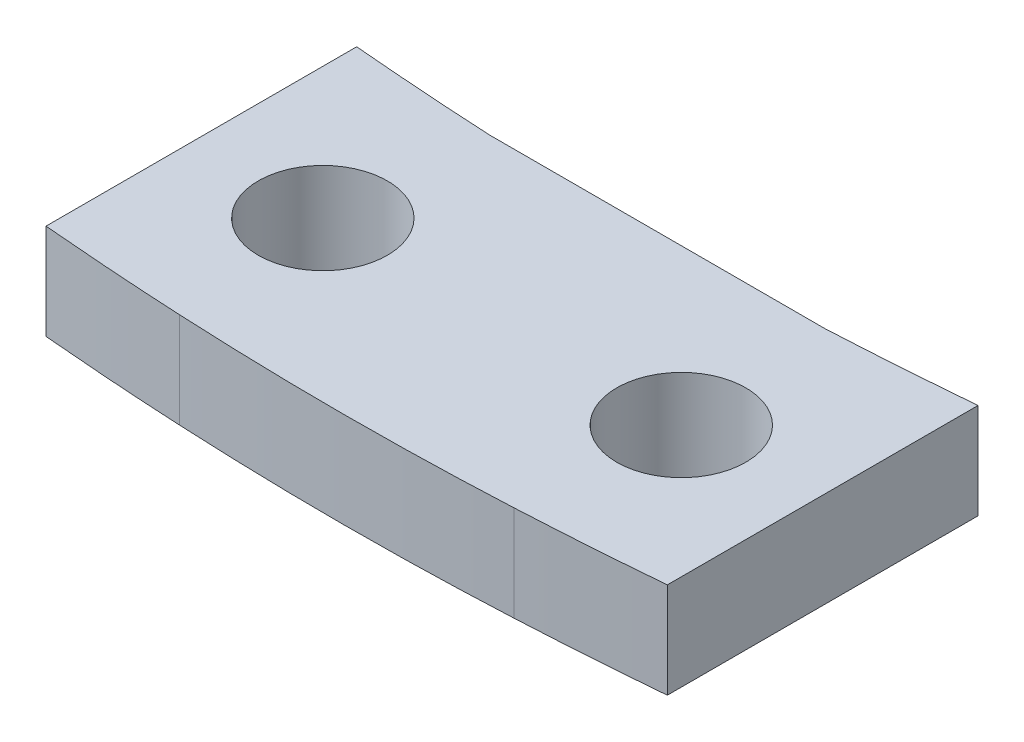
ISO-10303-21;
HEADER;
FILE_DESCRIPTION(('STEP AP214'),'2;1');
FILE_NAME('part.step','',(''),(''),'','','');
FILE_SCHEMA(('AUTOMOTIVE_DESIGN { 1 0 10303 214 1 1 1 1 }'));
ENDSEC;
DATA;
#1=APPLICATION_CONTEXT('core data for automotive mechanical design processes');
#2=APPLICATION_PROTOCOL_DEFINITION('international standard','automotive_design',2000,#1);
#3=PRODUCT_CONTEXT('',#1,'mechanical');
#4=PRODUCT('Part','Part','',(#3));
#5=PRODUCT_RELATED_PRODUCT_CATEGORY('part','',(#4));
#6=PRODUCT_DEFINITION_FORMATION('','',#4);
#7=PRODUCT_DEFINITION_CONTEXT('part definition',#1,'design');
#8=PRODUCT_DEFINITION('design','',#6,#7);
#9=PRODUCT_DEFINITION_SHAPE('','',#8);
#10=(LENGTH_UNIT() NAMED_UNIT(*) SI_UNIT(.MILLI.,.METRE.));
#11=(NAMED_UNIT(*) PLANE_ANGLE_UNIT() SI_UNIT($,.RADIAN.));
#12=(NAMED_UNIT(*) SI_UNIT($,.STERADIAN.) SOLID_ANGLE_UNIT());
#13=UNCERTAINTY_MEASURE_WITH_UNIT(LENGTH_MEASURE(1.E-05),#10,'distance_accuracy_value','');
#14=(GEOMETRIC_REPRESENTATION_CONTEXT(3) GLOBAL_UNCERTAINTY_ASSIGNED_CONTEXT((#13)) GLOBAL_UNIT_ASSIGNED_CONTEXT((#10,
#11,#12)) REPRESENTATION_CONTEXT('',''));
#15=CARTESIAN_POINT('',(0.,0.,0.));
#16=DIRECTION('',(0.,0.,1.));
#17=DIRECTION('',(1.,0.,0.));
#18=AXIS2_PLACEMENT_3D('',#15,#16,#17);
#19=CARTESIAN_POINT('',(10.0017972964312,4.,-6.68003144721764));
#20=DIRECTION('',(0.,-1.,0.));
#21=DIRECTION('',(0.,0.,-1.));
#22=AXIS2_PLACEMENT_3D('',#19,#20,#21);
#23=PLANE('',#22);
#24=CARTESIAN_POINT('',(-7.50000000000098,4.,0.));
#25=DIRECTION('',(0.,1.,0.));
#26=DIRECTION('',(0.,0.,1.));
#27=AXIS2_PLACEMENT_3D('',#24,#25,#26);
#28=CIRCLE('',#27,2.7);
#29=CARTESIAN_POINT('',(-7.50000000000098,4.,2.69999999999992));
#30=VERTEX_POINT('',#29);
#31=EDGE_CURVE('E213',#30,#30,#28,.T.);
#32=ORIENTED_EDGE('',*,*,#31,.F.);
#33=EDGE_LOOP('',(#32));
#34=FACE_BOUND('',#33,.T.);
#35=CARTESIAN_POINT('',(12.9999999999979,4.,-6.9165988328568));
#36=CARTESIAN_POINT('',(11.0025987207412,4.,-6.74133582895128));
#37=CARTESIAN_POINT('',(9.00219406974358,4.,-6.59988175267683));
#38=CARTESIAN_POINT('',(6.99999999999719,4.,-6.50000000000001));
#39=B_SPLINE_CURVE_WITH_KNOTS('',3,(#35,#36,#37,#38),.UNSPECIFIED.,.F.,.F.,(4,4),
(0.769001891352631,1.),.UNSPECIFIED.);
#40=CARTESIAN_POINT('',(12.9999999999985,4.,-6.9165988328568));
#41=VERTEX_POINT('',#40);
#42=CARTESIAN_POINT('',(6.9999999999981,4.,-6.50000000000009));
#43=VERTEX_POINT('',#42);
#44=EDGE_CURVE('E218',#41,#43,#39,.T.);
#45=ORIENTED_EDGE('',*,*,#44,.T.);
#46=DIRECTION('',(-1.,0.,0.));
#47=VECTOR('',#46,1.);
#48=CARTESIAN_POINT('',(6.9999999999981,4.,-6.50000000000009));
#49=LINE('',#48,#47);
#50=CARTESIAN_POINT('',(-6.99999999999916,4.,-6.50000000000001));
#51=VERTEX_POINT('',#50);
#52=EDGE_CURVE('E96',#43,#51,#49,.T.);
#53=ORIENTED_EDGE('',*,*,#52,.T.);
#54=CARTESIAN_POINT('',(-6.99999999999916,4.,-6.50000000000001));
#55=CARTESIAN_POINT('',(-9.00219406974555,4.,-6.59988175267683));
#56=CARTESIAN_POINT('',(-11.0025987207431,4.,-6.74133582895128));
#57=CARTESIAN_POINT('',(-12.9999999999998,4.,-6.9165988328568));
#58=B_SPLINE_CURVE_WITH_KNOTS('',3,(#54,#55,#56,#57),.UNSPECIFIED.,.F.,.F.,(4,4),
(1.4770263050022E-08,0.230998108647369),.UNSPECIFIED.);
#59=CARTESIAN_POINT('',(-12.9999996139176,4.,-6.91659883267921));
#60=VERTEX_POINT('',#59);
#61=EDGE_CURVE('E165',#51,#60,#58,.T.);
#62=ORIENTED_EDGE('',*,*,#61,.T.);
#63=DIRECTION('',(2.96987209127525E-08,0.,1.));
#64=VECTOR('',#63,1.);
#65=CARTESIAN_POINT('',(-12.9999996139176,4.,-6.91659883267921));
#66=LINE('',#65,#64);
#67=CARTESIAN_POINT('',(-12.9999992278342,4.,6.08340116746147));
#68=VERTEX_POINT('',#67);
#69=EDGE_CURVE('E160',#60,#68,#66,.T.);
#70=ORIENTED_EDGE('',*,*,#69,.T.);
#71=CARTESIAN_POINT('',(-12.9999992278342,4.,6.08340116746147));
#72=CARTESIAN_POINT('',(-12.1211629849982,4.,6.16051510618781));
#73=CARTESIAN_POINT('',(-10.1223810082025,4.,6.32090639475334));
#74=CARTESIAN_POINT('',(-8.12129399454022,4.,6.44406292196092));
#75=CARTESIAN_POINT('',(-6.99999922783502,4.,6.50000000031819));
#76=B_SPLINE_CURVE_WITH_KNOTS('',3,(#71,#72,#73,#74,#75),.UNSPECIFIED.,.F.,.F.,(4,1,4),(0.,
0.439999999999999,1.),.UNSPECIFIED.);
#77=CARTESIAN_POINT('',(-6.99999922783502,4.,6.50000000031818));
#78=VERTEX_POINT('',#77);
#79=EDGE_CURVE('E115',#68,#78,#76,.T.);
#80=ORIENTED_EDGE('',*,*,#79,.T.);
#81=CARTESIAN_POINT('',(-6.99999922783502,4.,6.50000000031818));
#82=CARTESIAN_POINT('',(-6.83482132536355,4.,6.50824258978397));
#83=CARTESIAN_POINT('',(-6.66657307013394,4.,6.51634167540056));
#84=CARTESIAN_POINT('',(-5.63247488113291,4.,6.56436245256396));
#85=CARTESIAN_POINT('',(-3.74036308236667,4.,6.63500884707403));
#86=CARTESIAN_POINT('',(-1.57897075086872,4.,6.67211614631536));
#87=CARTESIAN_POINT('',(-0.278468619003161,4.,6.6760718491611));
#88=CARTESIAN_POINT('',(1.0209540113614,4.,6.67607223278236));
#89=CARTESIAN_POINT('',(3.17877266174523,4.,6.65206207836661));
#90=CARTESIAN_POINT('',(5.35042834294158,4.,6.57745990935508));
#91=CARTESIAN_POINT('',(6.66656696375473,4.,6.51634200508511));
#92=CARTESIAN_POINT('',(6.83481906783122,4.,6.50824274079048));
#93=CARTESIAN_POINT('',(6.9999999999998,4.,6.49999999999991));
#94=B_SPLINE_CURVE_WITH_KNOTS('',3,(#81,#82,#83,#84,#85,#86,#87,#88,#89,#90,#91,#92,#93),
.UNSPECIFIED.,.F.,.F.,(4,2,1,1,2,1,2,4),(0.,0.0364473066080108,0.22,0.44,0.499999692500397,
0.720000000000002,0.963552078392782,1.),.UNSPECIFIED.);
#95=CARTESIAN_POINT('',(6.99999999999864,4.,6.50000000003682));
#96=VERTEX_POINT('',#95);
#97=EDGE_CURVE('E109',#78,#96,#94,.T.);
#98=ORIENTED_EDGE('',*,*,#97,.T.);
#99=CARTESIAN_POINT('',(6.99999999999864,4.,6.50000000003682));
#100=CARTESIAN_POINT('',(7.88096539068684,4.,6.45605202885903));
#101=CARTESIAN_POINT('',(9.88237211618328,4.,6.33787845379927));
#102=CARTESIAN_POINT('',(11.8814552836144,4.,6.18154844936717));
#103=CARTESIAN_POINT('',(12.9999999999979,4.,6.0834011671801));
#104=B_SPLINE_CURVE_WITH_KNOTS('',3,(#99,#100,#101,#102,#103),.UNSPECIFIED.,.F.,.F.,(4,1,4),(0.,
0.44,1.),.UNSPECIFIED.);
#105=CARTESIAN_POINT('',(12.999999999999,4.,6.0834011671432));
#106=VERTEX_POINT('',#105);
#107=EDGE_CURVE('E113',#96,#106,#104,.T.);
#108=ORIENTED_EDGE('',*,*,#107,.T.);
#109=DIRECTION('',(0.,0.,-1.));
#110=VECTOR('',#109,1.);
#111=CARTESIAN_POINT('',(12.9999999999985,4.,-6.9165988328568));
#112=LINE('',#111,#110);
#113=EDGE_CURVE('E53',#106,#41,#112,.T.);
#114=ORIENTED_EDGE('',*,*,#113,.T.);
#115=EDGE_LOOP('',(#45,#53,#62,#70,#80,#98,#108,#114));
#116=FACE_BOUND('',#115,.T.);
#117=CARTESIAN_POINT('',(7.49999999999902,4.,0.));
#118=DIRECTION('',(0.,1.,0.));
#119=DIRECTION('',(0.,0.,1.));
#120=AXIS2_PLACEMENT_3D('',#117,#118,#119);
#121=CIRCLE('',#120,2.7);
#122=CARTESIAN_POINT('',(7.49999999999902,4.,2.69999999999992));
#123=VERTEX_POINT('',#122);
#124=EDGE_CURVE('E204',#123,#123,#121,.T.);
#125=ORIENTED_EDGE('',*,*,#124,.F.);
#126=EDGE_LOOP('',(#125));
#127=FACE_BOUND('',#126,.T.);
#128=ADVANCED_FACE('F35',(#34,#116,#127),#23,.F.);
#129=CARTESIAN_POINT('',(10.0017972964312,0.,-6.68003144721764));
#130=DIRECTION('',(0.,-1.,0.));
#131=DIRECTION('',(0.,0.,-1.));
#132=AXIS2_PLACEMENT_3D('',#129,#130,#131);
#133=PLANE('',#132);
#134=CARTESIAN_POINT('',(-7.50000000000098,0.,0.));
#135=DIRECTION('',(0.,1.,0.));
#136=DIRECTION('',(0.,0.,1.));
#137=AXIS2_PLACEMENT_3D('',#134,#135,#136);
#138=CIRCLE('',#137,2.7);
#139=CARTESIAN_POINT('',(-7.50000000000098,0.,2.69999999999992));
#140=VERTEX_POINT('',#139);
#141=EDGE_CURVE('E210',#140,#140,#138,.T.);
#142=ORIENTED_EDGE('',*,*,#141,.T.);
#143=EDGE_LOOP('',(#142));
#144=FACE_BOUND('',#143,.T.);
#145=CARTESIAN_POINT('',(12.9999999999979,0.,-6.9165988328568));
#146=CARTESIAN_POINT('',(11.0025987207412,0.,-6.74133582895128));
#147=CARTESIAN_POINT('',(9.00219406974358,0.,-6.59988175267683));
#148=CARTESIAN_POINT('',(6.99999999999719,0.,-6.50000000000001));
#149=B_SPLINE_CURVE_WITH_KNOTS('',3,(#145,#146,#147,#148),.UNSPECIFIED.,.F.,.F.,(4,4),
(0.769001891352631,1.),.UNSPECIFIED.);
#150=CARTESIAN_POINT('',(12.9999999999985,0.,-6.9165988328568));
#151=VERTEX_POINT('',#150);
#152=CARTESIAN_POINT('',(6.9999999999981,0.,-6.50000000000009));
#153=VERTEX_POINT('',#152);
#154=EDGE_CURVE('E216',#151,#153,#149,.T.);
#155=ORIENTED_EDGE('',*,*,#154,.F.);
#156=DIRECTION('',(0.,0.,-1.));
#157=VECTOR('',#156,1.);
#158=CARTESIAN_POINT('',(12.9999999999985,0.,-6.9165988328568));
#159=LINE('',#158,#157);
#160=CARTESIAN_POINT('',(12.999999999999,0.,6.0834011671432));
#161=VERTEX_POINT('',#160);
#162=EDGE_CURVE('E88',#161,#151,#159,.T.);
#163=ORIENTED_EDGE('',*,*,#162,.F.);
#164=CARTESIAN_POINT('',(6.99999999999864,0.,6.50000000003682));
#165=CARTESIAN_POINT('',(7.88096539068684,0.,6.45605202885903));
#166=CARTESIAN_POINT('',(9.88237211618328,0.,6.33787845379927));
#167=CARTESIAN_POINT('',(11.8814552836144,0.,6.18154844936717));
#168=CARTESIAN_POINT('',(12.9999999999979,0.,6.0834011671801));
#169=B_SPLINE_CURVE_WITH_KNOTS('',3,(#164,#165,#166,#167,#168),.UNSPECIFIED.,.F.,.F.,(4,1,4),
(0.,0.44,1.),.UNSPECIFIED.);
#170=CARTESIAN_POINT('',(6.99999999999864,0.,6.50000000003682));
#171=VERTEX_POINT('',#170);
#172=EDGE_CURVE('E82',#171,#161,#169,.T.);
#173=ORIENTED_EDGE('',*,*,#172,.F.);
#174=CARTESIAN_POINT('',(-6.99999922783502,0.,6.50000000031818));
#175=CARTESIAN_POINT('',(-6.83482132536355,0.,6.50824258978397));
#176=CARTESIAN_POINT('',(-6.66657307013394,0.,6.51634167540056));
#177=CARTESIAN_POINT('',(-5.63247488113291,0.,6.56436245256396));
#178=CARTESIAN_POINT('',(-3.74036308236667,0.,6.63500884707403));
#179=CARTESIAN_POINT('',(-1.57897075086872,0.,6.67211614631536));
#180=CARTESIAN_POINT('',(-0.278468619003161,0.,6.6760718491611));
#181=CARTESIAN_POINT('',(1.0209540113614,0.,6.67607223278236));
#182=CARTESIAN_POINT('',(3.17877266174523,0.,6.65206207836661));
#183=CARTESIAN_POINT('',(5.35042834294158,0.,6.57745990935508));
#184=CARTESIAN_POINT('',(6.66656696375473,0.,6.51634200508511));
#185=CARTESIAN_POINT('',(6.83481906783122,0.,6.50824274079048));
#186=CARTESIAN_POINT('',(6.9999999999998,0.,6.49999999999991));
#187=B_SPLINE_CURVE_WITH_KNOTS('',3,(#174,#175,#176,#177,#178,#179,#180,#181,#182,#183,#184,
#185,#186),.UNSPECIFIED.,.F.,.F.,(4,2,1,1,2,1,2,4),(0.,0.0364473066080108,0.22,0.44,
0.499999692500397,0.720000000000002,0.963552078392782,1.),.UNSPECIFIED.);
#188=CARTESIAN_POINT('',(-6.99999922783502,0.,6.50000000031818));
#189=VERTEX_POINT('',#188);
#190=EDGE_CURVE('E123',#189,#171,#187,.T.);
#191=ORIENTED_EDGE('',*,*,#190,.F.);
#192=CARTESIAN_POINT('',(-12.9999992278342,0.,6.08340116746147));
#193=CARTESIAN_POINT('',(-12.1211629849982,0.,6.16051510618781));
#194=CARTESIAN_POINT('',(-10.1223810082025,0.,6.32090639475334));
#195=CARTESIAN_POINT('',(-8.12129399454022,0.,6.44406292196092));
#196=CARTESIAN_POINT('',(-6.99999922783502,0.,6.50000000031819));
#197=B_SPLINE_CURVE_WITH_KNOTS('',3,(#192,#193,#194,#195,#196),.UNSPECIFIED.,.F.,.F.,(4,1,4),
(0.,0.439999999999999,1.),.UNSPECIFIED.);
#198=CARTESIAN_POINT('',(-12.9999992278342,0.,6.08340116746147));
#199=VERTEX_POINT('',#198);
#200=EDGE_CURVE('E253',#199,#189,#197,.T.);
#201=ORIENTED_EDGE('',*,*,#200,.F.);
#202=DIRECTION('',(2.96987209127525E-08,0.,1.));
#203=VECTOR('',#202,1.);
#204=CARTESIAN_POINT('',(-12.9999996139176,0.,-6.91659883267921));
#205=LINE('',#204,#203);
#206=CARTESIAN_POINT('',(-12.9999996139176,0.,-6.91659883267921));
#207=VERTEX_POINT('',#206);
#208=EDGE_CURVE('E251',#207,#199,#205,.T.);
#209=ORIENTED_EDGE('',*,*,#208,.F.);
#210=CARTESIAN_POINT('',(-6.99999999999916,0.,-6.50000000000001));
#211=CARTESIAN_POINT('',(-9.00219406974555,0.,-6.59988175267683));
#212=CARTESIAN_POINT('',(-11.0025987207431,0.,-6.74133582895128));
#213=CARTESIAN_POINT('',(-12.9999999999998,0.,-6.9165988328568));
#214=B_SPLINE_CURVE_WITH_KNOTS('',3,(#210,#211,#212,#213),.UNSPECIFIED.,.F.,.F.,(4,4),
(1.4770263050022E-08,0.230998108647369),.UNSPECIFIED.);
#215=CARTESIAN_POINT('',(-6.99999999999916,0.,-6.50000000000001));
#216=VERTEX_POINT('',#215);
#217=EDGE_CURVE('E245',#216,#207,#214,.T.);
#218=ORIENTED_EDGE('',*,*,#217,.F.);
#219=DIRECTION('',(-1.,0.,0.));
#220=VECTOR('',#219,1.);
#221=CARTESIAN_POINT('',(6.9999999999981,0.,-6.50000000000009));
#222=LINE('',#221,#220);
#223=EDGE_CURVE('E249',#153,#216,#222,.T.);
#224=ORIENTED_EDGE('',*,*,#223,.F.);
#225=EDGE_LOOP('',(#155,#163,#173,#191,#201,#209,#218,#224));
#226=FACE_BOUND('',#225,.T.);
#227=CARTESIAN_POINT('',(7.49999999999902,0.,0.));
#228=DIRECTION('',(0.,1.,0.));
#229=DIRECTION('',(0.,0.,1.));
#230=AXIS2_PLACEMENT_3D('',#227,#228,#229);
#231=CIRCLE('',#230,2.7);
#232=CARTESIAN_POINT('',(7.49999999999902,0.,2.69999999999992));
#233=VERTEX_POINT('',#232);
#234=EDGE_CURVE('E207',#233,#233,#231,.T.);
#235=ORIENTED_EDGE('',*,*,#234,.T.);
#236=EDGE_LOOP('',(#235));
#237=FACE_BOUND('',#236,.T.);
#238=ADVANCED_FACE('F181',(#144,#226,#237),#133,.T.);
#239=DIRECTION('',(0.,-1.,0.));
#240=VECTOR('',#239,1.);
#241=SURFACE_OF_LINEAR_EXTRUSION('',#39,#240);
#242=ORIENTED_EDGE('',*,*,#154,.T.);
#243=DIRECTION('',(0.,-1.,0.));
#244=VECTOR('',#243,1.);
#245=CARTESIAN_POINT('',(6.9999999999981,4.,-6.50000000000009));
#246=LINE('',#245,#244);
#247=EDGE_CURVE('E11',#43,#153,#246,.T.);
#248=ORIENTED_EDGE('',*,*,#247,.F.);
#249=ORIENTED_EDGE('',*,*,#44,.F.);
#250=DIRECTION('',(0.,-1.,0.));
#251=VECTOR('',#250,1.);
#252=CARTESIAN_POINT('',(12.9999999999985,4.,-6.9165988328568));
#253=LINE('',#252,#251);
#254=EDGE_CURVE('E129',#41,#151,#253,.T.);
#255=ORIENTED_EDGE('',*,*,#254,.T.);
#256=EDGE_LOOP('',(#242,#248,#249,#255));
#257=FACE_BOUND('',#256,.T.);
#258=ADVANCED_FACE('F37',(#257),#241,.F.);
#259=CARTESIAN_POINT('',(6.9999999999981,4.,-6.50000000000009));
#260=DIRECTION('',(0.,0.,1.));
#261=DIRECTION('',(1.,0.,0.));
#262=AXIS2_PLACEMENT_3D('',#259,#260,#261);
#263=PLANE('',#262);
#264=ORIENTED_EDGE('',*,*,#223,.T.);
#265=DIRECTION('',(0.,-1.,0.));
#266=VECTOR('',#265,1.);
#267=CARTESIAN_POINT('',(-6.99999999999916,4.,-6.50000000000001));
#268=LINE('',#267,#266);
#269=EDGE_CURVE('E45',#51,#216,#268,.T.);
#270=ORIENTED_EDGE('',*,*,#269,.F.);
#271=ORIENTED_EDGE('',*,*,#52,.F.);
#272=ORIENTED_EDGE('',*,*,#247,.T.);
#273=EDGE_LOOP('',(#264,#270,#271,#272));
#274=FACE_BOUND('',#273,.T.);
#275=ADVANCED_FACE('F175',(#274),#263,.F.);
#276=DIRECTION('',(0.,-1.,0.));
#277=VECTOR('',#276,1.);
#278=SURFACE_OF_LINEAR_EXTRUSION('',#58,#277);
#279=ORIENTED_EDGE('',*,*,#217,.T.);
#280=DIRECTION('',(0.,-1.,0.));
#281=VECTOR('',#280,1.);
#282=CARTESIAN_POINT('',(-12.9999996139176,4.,-6.91659883267921));
#283=LINE('',#282,#281);
#284=EDGE_CURVE('E239',#60,#207,#283,.T.);
#285=ORIENTED_EDGE('',*,*,#284,.F.);
#286=ORIENTED_EDGE('',*,*,#61,.F.);
#287=ORIENTED_EDGE('',*,*,#269,.T.);
#288=EDGE_LOOP('',(#279,#285,#286,#287));
#289=FACE_BOUND('',#288,.T.);
#290=ADVANCED_FACE('F173',(#289),#278,.F.);
#291=CARTESIAN_POINT('',(-12.9999996139176,4.,-6.91659883267921));
#292=DIRECTION('',(1.,0.,-2.96987209127525E-08));
#293=DIRECTION('',(-2.96987209127525E-08,0.,-1.));
#294=AXIS2_PLACEMENT_3D('',#291,#292,#293);
#295=PLANE('',#294);
#296=ORIENTED_EDGE('',*,*,#208,.T.);
#297=DIRECTION('',(0.,-1.,0.));
#298=VECTOR('',#297,1.);
#299=CARTESIAN_POINT('',(-12.9999992278342,4.,6.08340116746147));
#300=LINE('',#299,#298);
#301=EDGE_CURVE('E236',#68,#199,#300,.T.);
#302=ORIENTED_EDGE('',*,*,#301,.F.);
#303=ORIENTED_EDGE('',*,*,#69,.F.);
#304=ORIENTED_EDGE('',*,*,#284,.T.);
#305=EDGE_LOOP('',(#296,#302,#303,#304));
#306=FACE_BOUND('',#305,.T.);
#307=ADVANCED_FACE('F153',(#306),#295,.F.);
#308=DIRECTION('',(0.,-1.,0.));
#309=VECTOR('',#308,1.);
#310=SURFACE_OF_LINEAR_EXTRUSION('',#76,#309);
#311=ORIENTED_EDGE('',*,*,#200,.T.);
#312=DIRECTION('',(0.,-1.,0.));
#313=VECTOR('',#312,1.);
#314=CARTESIAN_POINT('',(-6.99999922783502,4.,6.50000000031818));
#315=LINE('',#314,#313);
#316=EDGE_CURVE('E124',#78,#189,#315,.T.);
#317=ORIENTED_EDGE('',*,*,#316,.F.);
#318=ORIENTED_EDGE('',*,*,#79,.F.);
#319=ORIENTED_EDGE('',*,*,#301,.T.);
#320=EDGE_LOOP('',(#311,#317,#318,#319));
#321=FACE_BOUND('',#320,.T.);
#322=ADVANCED_FACE('F150',(#321),#310,.F.);
#323=DIRECTION('',(0.,-1.,0.));
#324=VECTOR('',#323,1.);
#325=SURFACE_OF_LINEAR_EXTRUSION('',#94,#324);
#326=ORIENTED_EDGE('',*,*,#190,.T.);
#327=DIRECTION('',(0.,-1.,0.));
#328=VECTOR('',#327,1.);
#329=CARTESIAN_POINT('',(6.99999999999864,4.,6.50000000003682));
#330=LINE('',#329,#328);
#331=EDGE_CURVE('E120',#96,#171,#330,.T.);
#332=ORIENTED_EDGE('',*,*,#331,.F.);
#333=ORIENTED_EDGE('',*,*,#97,.F.);
#334=ORIENTED_EDGE('',*,*,#316,.T.);
#335=EDGE_LOOP('',(#326,#332,#333,#334));
#336=FACE_BOUND('',#335,.T.);
#337=ADVANCED_FACE('F121',(#336),#325,.F.);
#338=DIRECTION('',(0.,-1.,0.));
#339=VECTOR('',#338,1.);
#340=SURFACE_OF_LINEAR_EXTRUSION('',#104,#339);
#341=ORIENTED_EDGE('',*,*,#172,.T.);
#342=DIRECTION('',(0.,-1.,0.));
#343=VECTOR('',#342,1.);
#344=CARTESIAN_POINT('',(12.999999999999,4.,6.0834011671432));
#345=LINE('',#344,#343);
#346=EDGE_CURVE('E125',#106,#161,#345,.T.);
#347=ORIENTED_EDGE('',*,*,#346,.F.);
#348=ORIENTED_EDGE('',*,*,#107,.F.);
#349=ORIENTED_EDGE('',*,*,#331,.T.);
#350=EDGE_LOOP('',(#341,#347,#348,#349));
#351=FACE_BOUND('',#350,.T.);
#352=ADVANCED_FACE('F127',(#351),#340,.F.);
#353=CARTESIAN_POINT('',(12.9999999999985,4.,-6.9165988328568));
#354=DIRECTION('',(-1.,0.,0.));
#355=DIRECTION('',(0.,0.,1.));
#356=AXIS2_PLACEMENT_3D('',#353,#354,#355);
#357=PLANE('',#356);
#358=ORIENTED_EDGE('',*,*,#162,.T.);
#359=ORIENTED_EDGE('',*,*,#254,.F.);
#360=ORIENTED_EDGE('',*,*,#113,.F.);
#361=ORIENTED_EDGE('',*,*,#346,.T.);
#362=EDGE_LOOP('',(#358,#359,#360,#361));
#363=FACE_BOUND('',#362,.T.);
#364=ADVANCED_FACE('F146',(#363),#357,.F.);
#365=CARTESIAN_POINT('',(-7.50000000000098,4.,0.));
#366=DIRECTION('',(0.,-1.,0.));
#367=DIRECTION('',(0.,0.,-1.));
#368=AXIS2_PLACEMENT_3D('',#365,#366,#367);
#369=CYLINDRICAL_SURFACE('',#368,2.7);
#370=ORIENTED_EDGE('',*,*,#31,.T.);
#371=EDGE_LOOP('',(#370));
#372=FACE_BOUND('',#371,.T.);
#373=ORIENTED_EDGE('',*,*,#141,.F.);
#374=EDGE_LOOP('',(#373));
#375=FACE_BOUND('',#374,.T.);
#376=ADVANCED_FACE('F192',(#372,#375),#369,.F.);
#377=CARTESIAN_POINT('',(7.49999999999902,4.,0.));
#378=DIRECTION('',(0.,-1.,0.));
#379=DIRECTION('',(0.,0.,-1.));
#380=AXIS2_PLACEMENT_3D('',#377,#378,#379);
#381=CYLINDRICAL_SURFACE('',#380,2.7);
#382=ORIENTED_EDGE('',*,*,#124,.T.);
#383=EDGE_LOOP('',(#382));
#384=FACE_BOUND('',#383,.T.);
#385=ORIENTED_EDGE('',*,*,#234,.F.);
#386=EDGE_LOOP('',(#385));
#387=FACE_BOUND('',#386,.T.);
#388=ADVANCED_FACE('F195',(#384,#387),#381,.F.);
#389=CLOSED_SHELL('',(#128,#238,#258,#275,#290,#307,#322,#337,#352,#364,#376,#388));
#390=MANIFOLD_SOLID_BREP('B2',#389);
#391=ADVANCED_BREP_SHAPE_REPRESENTATION('',(#18,#390),#14);
#392=SHAPE_DEFINITION_REPRESENTATION(#9,#391);
ENDSEC;
END-ISO-10303-21;
